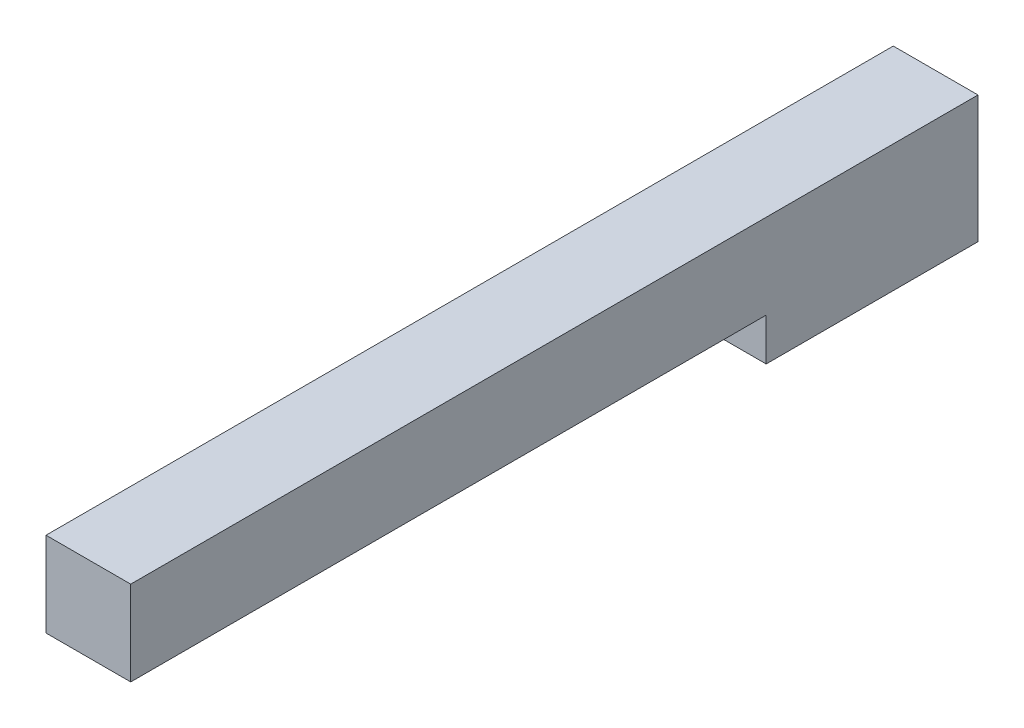
ISO-10303-21;
HEADER;
FILE_DESCRIPTION(('STEP AP214'),'2;1');
FILE_NAME('part.step','',(''),(''),'','','');
FILE_SCHEMA(('AUTOMOTIVE_DESIGN { 1 0 10303 214 1 1 1 1 }'));
ENDSEC;
DATA;
#1=APPLICATION_CONTEXT('core data for automotive mechanical design processes');
#2=APPLICATION_PROTOCOL_DEFINITION('international standard','automotive_design',2000,#1);
#3=PRODUCT_CONTEXT('',#1,'mechanical');
#4=PRODUCT('Part','Part','',(#3));
#5=PRODUCT_RELATED_PRODUCT_CATEGORY('part','',(#4));
#6=PRODUCT_DEFINITION_FORMATION('','',#4);
#7=PRODUCT_DEFINITION_CONTEXT('part definition',#1,'design');
#8=PRODUCT_DEFINITION('design','',#6,#7);
#9=PRODUCT_DEFINITION_SHAPE('','',#8);
#10=(LENGTH_UNIT() NAMED_UNIT(*) SI_UNIT(.MILLI.,.METRE.));
#11=(NAMED_UNIT(*) PLANE_ANGLE_UNIT() SI_UNIT($,.RADIAN.));
#12=(NAMED_UNIT(*) SI_UNIT($,.STERADIAN.) SOLID_ANGLE_UNIT());
#13=UNCERTAINTY_MEASURE_WITH_UNIT(LENGTH_MEASURE(1.E-05),#10,'distance_accuracy_value','');
#14=(GEOMETRIC_REPRESENTATION_CONTEXT(3) GLOBAL_UNCERTAINTY_ASSIGNED_CONTEXT((#13)) GLOBAL_UNIT_ASSIGNED_CONTEXT((#10,
#11,#12)) REPRESENTATION_CONTEXT('',''));
#15=CARTESIAN_POINT('',(0.,0.,0.));
#16=DIRECTION('',(0.,0.,1.));
#17=DIRECTION('',(1.,0.,0.));
#18=AXIS2_PLACEMENT_3D('',#15,#16,#17);
#19=CARTESIAN_POINT('',(2.,3.,10.));
#20=DIRECTION('',(-1.,0.,0.));
#21=DIRECTION('',(0.,-1.,0.));
#22=AXIS2_PLACEMENT_3D('',#19,#20,#21);
#23=PLANE('',#22);
#24=DIRECTION('',(0.,1.,0.));
#25=VECTOR('',#24,1.);
#26=CARTESIAN_POINT('',(2.,3.,0.));
#27=LINE('',#26,#25);
#28=CARTESIAN_POINT('',(2.,-3.,0.));
#29=VERTEX_POINT('',#28);
#30=CARTESIAN_POINT('',(2.,3.,0.));
#31=VERTEX_POINT('',#30);
#32=EDGE_CURVE('E88',#29,#31,#27,.T.);
#33=ORIENTED_EDGE('',*,*,#32,.T.);
#34=DIRECTION('',(0.,0.,-1.));
#35=VECTOR('',#34,1.);
#36=CARTESIAN_POINT('',(2.,3.,10.));
#37=LINE('',#36,#35);
#38=CARTESIAN_POINT('',(2.,3.,40.));
#39=VERTEX_POINT('',#38);
#40=EDGE_CURVE('E11',#39,#31,#37,.T.);
#41=ORIENTED_EDGE('',*,*,#40,.F.);
#42=DIRECTION('',(0.,1.,0.));
#43=VECTOR('',#42,1.);
#44=CARTESIAN_POINT('',(2.,3.,40.));
#45=LINE('',#44,#43);
#46=CARTESIAN_POINT('',(2.,-1.,40.));
#47=VERTEX_POINT('',#46);
#48=EDGE_CURVE('E124',#47,#39,#45,.T.);
#49=ORIENTED_EDGE('',*,*,#48,.F.);
#50=DIRECTION('',(0.,0.,-1.));
#51=VECTOR('',#50,1.);
#52=CARTESIAN_POINT('',(2.,-1.,40.));
#53=LINE('',#52,#51);
#54=CARTESIAN_POINT('',(2.,-1.,10.));
#55=VERTEX_POINT('',#54);
#56=EDGE_CURVE('E97',#47,#55,#53,.T.);
#57=ORIENTED_EDGE('',*,*,#56,.T.);
#58=DIRECTION('',(0.,1.,0.));
#59=VECTOR('',#58,1.);
#60=CARTESIAN_POINT('',(2.,3.,10.));
#61=LINE('',#60,#59);
#62=CARTESIAN_POINT('',(2.,-3.,10.));
#63=VERTEX_POINT('',#62);
#64=EDGE_CURVE('E82',#63,#55,#61,.T.);
#65=ORIENTED_EDGE('',*,*,#64,.F.);
#66=DIRECTION('',(0.,0.,-1.));
#67=VECTOR('',#66,1.);
#68=CARTESIAN_POINT('',(2.,-3.,10.));
#69=LINE('',#68,#67);
#70=EDGE_CURVE('E75',#63,#29,#69,.T.);
#71=ORIENTED_EDGE('',*,*,#70,.T.);
#72=EDGE_LOOP('',(#33,#41,#49,#57,#65,#71));
#73=FACE_BOUND('',#72,.T.);
#74=ADVANCED_FACE('F33',(#73),#23,.F.);
#75=CARTESIAN_POINT('',(-2.,3.,10.));
#76=DIRECTION('',(0.,-1.,0.));
#77=DIRECTION('',(0.,0.,-1.));
#78=AXIS2_PLACEMENT_3D('',#75,#76,#77);
#79=PLANE('',#78);
#80=DIRECTION('',(-1.,0.,0.));
#81=VECTOR('',#80,1.);
#82=CARTESIAN_POINT('',(-2.,3.,0.));
#83=LINE('',#82,#81);
#84=CARTESIAN_POINT('',(-2.,3.,0.));
#85=VERTEX_POINT('',#84);
#86=EDGE_CURVE('E92',#31,#85,#83,.T.);
#87=ORIENTED_EDGE('',*,*,#86,.T.);
#88=DIRECTION('',(0.,0.,-1.));
#89=VECTOR('',#88,1.);
#90=CARTESIAN_POINT('',(-2.,3.,10.));
#91=LINE('',#90,#89);
#92=CARTESIAN_POINT('',(-2.,3.,40.));
#93=VERTEX_POINT('',#92);
#94=EDGE_CURVE('E40',#93,#85,#91,.T.);
#95=ORIENTED_EDGE('',*,*,#94,.F.);
#96=DIRECTION('',(-1.,0.,0.));
#97=VECTOR('',#96,1.);
#98=CARTESIAN_POINT('',(-2.,3.,40.));
#99=LINE('',#98,#97);
#100=EDGE_CURVE('E116',#39,#93,#99,.T.);
#101=ORIENTED_EDGE('',*,*,#100,.F.);
#102=ORIENTED_EDGE('',*,*,#40,.T.);
#103=EDGE_LOOP('',(#87,#95,#101,#102));
#104=FACE_BOUND('',#103,.T.);
#105=ADVANCED_FACE('F114',(#104),#79,.F.);
#106=CARTESIAN_POINT('',(-2.,3.,10.));
#107=DIRECTION('',(1.,0.,0.));
#108=DIRECTION('',(0.,1.,0.));
#109=AXIS2_PLACEMENT_3D('',#106,#107,#108);
#110=PLANE('',#109);
#111=DIRECTION('',(0.,-1.,0.));
#112=VECTOR('',#111,1.);
#113=CARTESIAN_POINT('',(-2.,3.,0.));
#114=LINE('',#113,#112);
#115=CARTESIAN_POINT('',(-2.,-3.,0.));
#116=VERTEX_POINT('',#115);
#117=EDGE_CURVE('E83',#85,#116,#114,.T.);
#118=ORIENTED_EDGE('',*,*,#117,.T.);
#119=DIRECTION('',(0.,0.,-1.));
#120=VECTOR('',#119,1.);
#121=CARTESIAN_POINT('',(-2.,-3.,10.));
#122=LINE('',#121,#120);
#123=CARTESIAN_POINT('',(-2.,-3.,10.));
#124=VERTEX_POINT('',#123);
#125=EDGE_CURVE('E78',#124,#116,#122,.T.);
#126=ORIENTED_EDGE('',*,*,#125,.F.);
#127=DIRECTION('',(0.,-1.,0.));
#128=VECTOR('',#127,1.);
#129=CARTESIAN_POINT('',(-2.,3.,10.));
#130=LINE('',#129,#128);
#131=CARTESIAN_POINT('',(-2.,-1.,10.));
#132=VERTEX_POINT('',#131);
#133=EDGE_CURVE('E132',#132,#124,#130,.T.);
#134=ORIENTED_EDGE('',*,*,#133,.F.);
#135=DIRECTION('',(0.,0.,-1.));
#136=VECTOR('',#135,1.);
#137=CARTESIAN_POINT('',(-2.,-1.,40.));
#138=LINE('',#137,#136);
#139=CARTESIAN_POINT('',(-2.,-1.,40.));
#140=VERTEX_POINT('',#139);
#141=EDGE_CURVE('E93',#140,#132,#138,.T.);
#142=ORIENTED_EDGE('',*,*,#141,.F.);
#143=DIRECTION('',(0.,-1.,0.));
#144=VECTOR('',#143,1.);
#145=CARTESIAN_POINT('',(-2.,3.,40.));
#146=LINE('',#145,#144);
#147=EDGE_CURVE('E110',#93,#140,#146,.T.);
#148=ORIENTED_EDGE('',*,*,#147,.F.);
#149=ORIENTED_EDGE('',*,*,#94,.T.);
#150=EDGE_LOOP('',(#118,#126,#134,#142,#148,#149));
#151=FACE_BOUND('',#150,.T.);
#152=ADVANCED_FACE('F107',(#151),#110,.F.);
#153=CARTESIAN_POINT('',(-2.,-3.,10.));
#154=DIRECTION('',(0.,1.,0.));
#155=DIRECTION('',(0.,0.,1.));
#156=AXIS2_PLACEMENT_3D('',#153,#154,#155);
#157=PLANE('',#156);
#158=DIRECTION('',(1.,0.,0.));
#159=VECTOR('',#158,1.);
#160=CARTESIAN_POINT('',(-2.,-3.,0.));
#161=LINE('',#160,#159);
#162=EDGE_CURVE('E72',#116,#29,#161,.T.);
#163=ORIENTED_EDGE('',*,*,#162,.T.);
#164=ORIENTED_EDGE('',*,*,#70,.F.);
#165=DIRECTION('',(1.,0.,0.));
#166=VECTOR('',#165,1.);
#167=CARTESIAN_POINT('',(-2.,-3.,10.));
#168=LINE('',#167,#166);
#169=EDGE_CURVE('E53',#124,#63,#168,.T.);
#170=ORIENTED_EDGE('',*,*,#169,.F.);
#171=ORIENTED_EDGE('',*,*,#125,.T.);
#172=EDGE_LOOP('',(#163,#164,#170,#171));
#173=FACE_BOUND('',#172,.T.);
#174=ADVANCED_FACE('F74',(#173),#157,.F.);
#175=CARTESIAN_POINT('',(0.,0.,10.));
#176=DIRECTION('',(0.,0.,1.));
#177=DIRECTION('',(1.,0.,0.));
#178=AXIS2_PLACEMENT_3D('',#175,#176,#177);
#179=PLANE('',#178);
#180=DIRECTION('',(1.,0.,0.));
#181=VECTOR('',#180,1.);
#182=CARTESIAN_POINT('',(-2.,-1.,10.));
#183=LINE('',#182,#181);
#184=EDGE_CURVE('E47',#132,#55,#183,.T.);
#185=ORIENTED_EDGE('',*,*,#184,.F.);
#186=ORIENTED_EDGE('',*,*,#133,.T.);
#187=ORIENTED_EDGE('',*,*,#169,.T.);
#188=ORIENTED_EDGE('',*,*,#64,.T.);
#189=EDGE_LOOP('',(#185,#186,#187,#188));
#190=FACE_BOUND('',#189,.T.);
#191=ADVANCED_FACE('F133',(#190),#179,.T.);
#192=CARTESIAN_POINT('',(0.,0.,0.));
#193=DIRECTION('',(0.,0.,1.));
#194=DIRECTION('',(1.,0.,0.));
#195=AXIS2_PLACEMENT_3D('',#192,#193,#194);
#196=PLANE('',#195);
#197=ORIENTED_EDGE('',*,*,#32,.F.);
#198=ORIENTED_EDGE('',*,*,#162,.F.);
#199=ORIENTED_EDGE('',*,*,#117,.F.);
#200=ORIENTED_EDGE('',*,*,#86,.F.);
#201=EDGE_LOOP('',(#197,#198,#199,#200));
#202=FACE_BOUND('',#201,.T.);
#203=ADVANCED_FACE('F91',(#202),#196,.F.);
#204=CARTESIAN_POINT('',(-2.,-1.,40.));
#205=DIRECTION('',(0.,1.,0.));
#206=DIRECTION('',(0.,0.,1.));
#207=AXIS2_PLACEMENT_3D('',#204,#205,#206);
#208=PLANE('',#207);
#209=ORIENTED_EDGE('',*,*,#184,.T.);
#210=ORIENTED_EDGE('',*,*,#56,.F.);
#211=DIRECTION('',(1.,0.,0.));
#212=VECTOR('',#211,1.);
#213=CARTESIAN_POINT('',(-2.,-1.,40.));
#214=LINE('',#213,#212);
#215=EDGE_CURVE('E127',#140,#47,#214,.T.);
#216=ORIENTED_EDGE('',*,*,#215,.F.);
#217=ORIENTED_EDGE('',*,*,#141,.T.);
#218=EDGE_LOOP('',(#209,#210,#216,#217));
#219=FACE_BOUND('',#218,.T.);
#220=ADVANCED_FACE('F136',(#219),#208,.F.);
#221=CARTESIAN_POINT('',(0.,0.,40.));
#222=DIRECTION('',(0.,0.,1.));
#223=DIRECTION('',(1.,0.,0.));
#224=AXIS2_PLACEMENT_3D('',#221,#222,#223);
#225=PLANE('',#224);
#226=ORIENTED_EDGE('',*,*,#147,.T.);
#227=ORIENTED_EDGE('',*,*,#215,.T.);
#228=ORIENTED_EDGE('',*,*,#48,.T.);
#229=ORIENTED_EDGE('',*,*,#100,.T.);
#230=EDGE_LOOP('',(#226,#227,#228,#229));
#231=FACE_BOUND('',#230,.T.);
#232=ADVANCED_FACE('F120',(#231),#225,.T.);
#233=CLOSED_SHELL('',(#74,#105,#152,#174,#191,#203,#220,#232));
#234=MANIFOLD_SOLID_BREP('B2',#233);
#235=ADVANCED_BREP_SHAPE_REPRESENTATION('',(#18,#234),#14);
#236=SHAPE_DEFINITION_REPRESENTATION(#9,#235);
ENDSEC;
END-ISO-10303-21;
